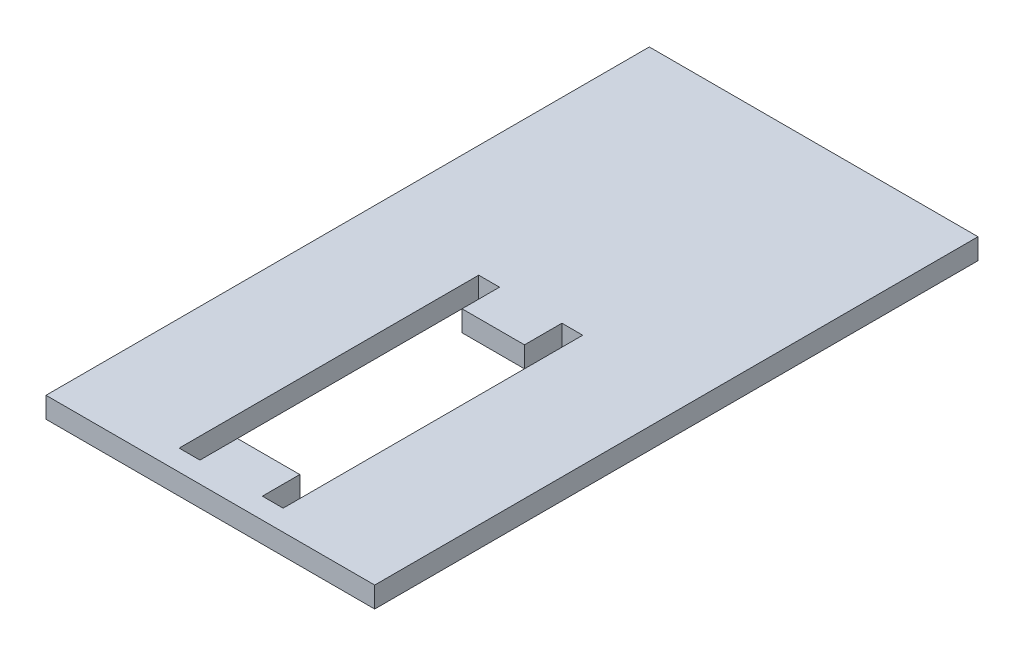
ISO-10303-21;
HEADER;
FILE_DESCRIPTION(('STEP AP214'),'2;1');
FILE_NAME('part.step','',(''),(''),'','','');
FILE_SCHEMA(('AUTOMOTIVE_DESIGN { 1 0 10303 214 1 1 1 1 }'));
ENDSEC;
DATA;
#1=APPLICATION_CONTEXT('core data for automotive mechanical design processes');
#2=APPLICATION_PROTOCOL_DEFINITION('international standard','automotive_design',2000,#1);
#3=PRODUCT_CONTEXT('',#1,'mechanical');
#4=PRODUCT('Part','Part','',(#3));
#5=PRODUCT_RELATED_PRODUCT_CATEGORY('part','',(#4));
#6=PRODUCT_DEFINITION_FORMATION('','',#4);
#7=PRODUCT_DEFINITION_CONTEXT('part definition',#1,'design');
#8=PRODUCT_DEFINITION('design','',#6,#7);
#9=PRODUCT_DEFINITION_SHAPE('','',#8);
#10=(LENGTH_UNIT() NAMED_UNIT(*) SI_UNIT(.MILLI.,.METRE.));
#11=(NAMED_UNIT(*) PLANE_ANGLE_UNIT() SI_UNIT($,.RADIAN.));
#12=(NAMED_UNIT(*) SI_UNIT($,.STERADIAN.) SOLID_ANGLE_UNIT());
#13=UNCERTAINTY_MEASURE_WITH_UNIT(LENGTH_MEASURE(1.E-05),#10,'distance_accuracy_value','');
#14=(GEOMETRIC_REPRESENTATION_CONTEXT(3) GLOBAL_UNCERTAINTY_ASSIGNED_CONTEXT((#13)) GLOBAL_UNIT_ASSIGNED_CONTEXT((#10,
#11,#12)) REPRESENTATION_CONTEXT('',''));
#15=CARTESIAN_POINT('',(0.,0.,0.));
#16=DIRECTION('',(0.,0.,1.));
#17=DIRECTION('',(1.,0.,0.));
#18=AXIS2_PLACEMENT_3D('',#15,#16,#17);
#19=CARTESIAN_POINT('',(-43.762748951782,5.,-45.3958726415094));
#20=DIRECTION('',(1.,0.,0.));
#21=DIRECTION('',(0.,0.,-1.));
#22=AXIS2_PLACEMENT_3D('',#19,#20,#21);
#23=PLANE('',#22);
#24=DIRECTION('',(0.,0.,1.));
#25=VECTOR('',#24,1.);
#26=CARTESIAN_POINT('',(-43.762748951782,0.,-45.3958726415094));
#27=LINE('',#26,#25);
#28=CARTESIAN_POINT('',(-43.762748951782,0.,-45.3958726415094));
#29=VERTEX_POINT('',#28);
#30=CARTESIAN_POINT('',(-43.7627489517819,0.,99.6041273584906));
#31=VERTEX_POINT('',#30);
#32=EDGE_CURVE('E157',#29,#31,#27,.T.);
#33=ORIENTED_EDGE('',*,*,#32,.T.);
#34=DIRECTION('',(0.,-1.,0.));
#35=VECTOR('',#34,1.);
#36=CARTESIAN_POINT('',(-43.7627489517819,5.,99.6041273584906));
#37=LINE('',#36,#35);
#38=CARTESIAN_POINT('',(-43.7627489517819,5.,99.6041273584906));
#39=VERTEX_POINT('',#38);
#40=EDGE_CURVE('E11',#39,#31,#37,.T.);
#41=ORIENTED_EDGE('',*,*,#40,.F.);
#42=DIRECTION('',(0.,0.,1.));
#43=VECTOR('',#42,1.);
#44=CARTESIAN_POINT('',(-43.762748951782,5.,-45.3958726415094));
#45=LINE('',#44,#43);
#46=CARTESIAN_POINT('',(-43.762748951782,5.,-45.3958726415094));
#47=VERTEX_POINT('',#46);
#48=EDGE_CURVE('E222',#47,#39,#45,.T.);
#49=ORIENTED_EDGE('',*,*,#48,.F.);
#50=DIRECTION('',(0.,-1.,0.));
#51=VECTOR('',#50,1.);
#52=CARTESIAN_POINT('',(-43.762748951782,5.,-45.3958726415094));
#53=LINE('',#52,#51);
#54=EDGE_CURVE('E232',#47,#29,#53,.T.);
#55=ORIENTED_EDGE('',*,*,#54,.T.);
#56=EDGE_LOOP('',(#33,#41,#49,#55));
#57=FACE_BOUND('',#56,.T.);
#58=ADVANCED_FACE('F31',(#57),#23,.F.);
#59=CARTESIAN_POINT('',(-43.7627489517819,5.,99.6041273584906));
#60=DIRECTION('',(0.,0.,-1.));
#61=DIRECTION('',(-1.,0.,0.));
#62=AXIS2_PLACEMENT_3D('',#59,#60,#61);
#63=PLANE('',#62);
#64=DIRECTION('',(1.,0.,0.));
#65=VECTOR('',#64,1.);
#66=CARTESIAN_POINT('',(-43.7627489517819,0.,99.6041273584906));
#67=LINE('',#66,#65);
#68=CARTESIAN_POINT('',(35.2372510482181,0.,99.6041273584906));
#69=VERTEX_POINT('',#68);
#70=EDGE_CURVE('E235',#31,#69,#67,.T.);
#71=ORIENTED_EDGE('',*,*,#70,.T.);
#72=DIRECTION('',(0.,-1.,0.));
#73=VECTOR('',#72,1.);
#74=CARTESIAN_POINT('',(35.2372510482181,5.,99.6041273584906));
#75=LINE('',#74,#73);
#76=CARTESIAN_POINT('',(35.2372510482181,5.,99.6041273584906));
#77=VERTEX_POINT('',#76);
#78=EDGE_CURVE('E38',#77,#69,#75,.T.);
#79=ORIENTED_EDGE('',*,*,#78,.F.);
#80=DIRECTION('',(1.,0.,0.));
#81=VECTOR('',#80,1.);
#82=CARTESIAN_POINT('',(-43.7627489517819,5.,99.6041273584906));
#83=LINE('',#82,#81);
#84=EDGE_CURVE('E225',#39,#77,#83,.T.);
#85=ORIENTED_EDGE('',*,*,#84,.F.);
#86=ORIENTED_EDGE('',*,*,#40,.T.);
#87=EDGE_LOOP('',(#71,#79,#85,#86));
#88=FACE_BOUND('',#87,.T.);
#89=ADVANCED_FACE('F263',(#88),#63,.F.);
#90=CARTESIAN_POINT('',(35.237251048218,5.,-45.3958726415094));
#91=DIRECTION('',(-1.,0.,0.));
#92=DIRECTION('',(0.,0.,1.));
#93=AXIS2_PLACEMENT_3D('',#90,#91,#92);
#94=PLANE('',#93);
#95=DIRECTION('',(0.,0.,-1.));
#96=VECTOR('',#95,1.);
#97=CARTESIAN_POINT('',(35.237251048218,0.,-45.3958726415094));
#98=LINE('',#97,#96);
#99=CARTESIAN_POINT('',(35.237251048218,0.,-45.3958726415094));
#100=VERTEX_POINT('',#99);
#101=EDGE_CURVE('E237',#69,#100,#98,.T.);
#102=ORIENTED_EDGE('',*,*,#101,.T.);
#103=DIRECTION('',(0.,-1.,0.));
#104=VECTOR('',#103,1.);
#105=CARTESIAN_POINT('',(35.237251048218,5.,-45.3958726415094));
#106=LINE('',#105,#104);
#107=CARTESIAN_POINT('',(35.237251048218,5.,-45.3958726415094));
#108=VERTEX_POINT('',#107);
#109=EDGE_CURVE('E242',#108,#100,#106,.T.);
#110=ORIENTED_EDGE('',*,*,#109,.F.);
#111=DIRECTION('',(0.,0.,-1.));
#112=VECTOR('',#111,1.);
#113=CARTESIAN_POINT('',(35.237251048218,5.,-45.3958726415094));
#114=LINE('',#113,#112);
#115=EDGE_CURVE('E228',#77,#108,#114,.T.);
#116=ORIENTED_EDGE('',*,*,#115,.F.);
#117=ORIENTED_EDGE('',*,*,#78,.T.);
#118=EDGE_LOOP('',(#102,#110,#116,#117));
#119=FACE_BOUND('',#118,.T.);
#120=ADVANCED_FACE('F249',(#119),#94,.F.);
#121=CARTESIAN_POINT('',(-43.762748951782,5.,-45.3958726415094));
#122=DIRECTION('',(0.,0.,1.));
#123=DIRECTION('',(1.,0.,0.));
#124=AXIS2_PLACEMENT_3D('',#121,#122,#123);
#125=PLANE('',#124);
#126=DIRECTION('',(-1.,0.,0.));
#127=VECTOR('',#126,1.);
#128=CARTESIAN_POINT('',(-43.762748951782,0.,-45.3958726415094));
#129=LINE('',#128,#127);
#130=EDGE_CURVE('E226',#100,#29,#129,.T.);
#131=ORIENTED_EDGE('',*,*,#130,.T.);
#132=ORIENTED_EDGE('',*,*,#54,.F.);
#133=DIRECTION('',(-1.,0.,0.));
#134=VECTOR('',#133,1.);
#135=CARTESIAN_POINT('',(-43.762748951782,5.,-45.3958726415094));
#136=LINE('',#135,#134);
#137=EDGE_CURVE('E230',#108,#47,#136,.T.);
#138=ORIENTED_EDGE('',*,*,#137,.F.);
#139=ORIENTED_EDGE('',*,*,#109,.T.);
#140=EDGE_LOOP('',(#131,#132,#138,#139));
#141=FACE_BOUND('',#140,.T.);
#142=ADVANCED_FACE('F256',(#141),#125,.F.);
#143=CARTESIAN_POINT('',(-43.7627489517819,5.,99.6041273584906));
#144=DIRECTION('',(0.,1.,0.));
#145=DIRECTION('',(0.,0.,1.));
#146=AXIS2_PLACEMENT_3D('',#143,#144,#145);
#147=PLANE('',#146);
#148=DIRECTION('',(0.,0.,1.));
#149=VECTOR('',#148,1.);
#150=CARTESIAN_POINT('',(-16.7627489517819,5.,22.6041273584906));
#151=LINE('',#150,#149);
#152=CARTESIAN_POINT('',(-16.7627489517819,5.,22.6041273584906));
#153=VERTEX_POINT('',#152);
#154=CARTESIAN_POINT('',(-16.7627489517819,5.,94.6041273584906));
#155=VERTEX_POINT('',#154);
#156=EDGE_CURVE('E45',#153,#155,#151,.T.);
#157=ORIENTED_EDGE('',*,*,#156,.F.);
#158=DIRECTION('',(-1.,0.,0.));
#159=VECTOR('',#158,1.);
#160=CARTESIAN_POINT('',(-16.7627489517819,5.,22.6041273584906));
#161=LINE('',#160,#159);
#162=CARTESIAN_POINT('',(-11.7627489517819,5.,22.6041273584906));
#163=VERTEX_POINT('',#162);
#164=EDGE_CURVE('E151',#163,#153,#161,.T.);
#165=ORIENTED_EDGE('',*,*,#164,.F.);
#166=DIRECTION('',(0.,0.,-1.));
#167=VECTOR('',#166,1.);
#168=CARTESIAN_POINT('',(-11.7627489517819,5.,22.6041273584906));
#169=LINE('',#168,#167);
#170=CARTESIAN_POINT('',(-11.7627489517819,5.,31.6041273584906));
#171=VERTEX_POINT('',#170);
#172=EDGE_CURVE('E197',#171,#163,#169,.T.);
#173=ORIENTED_EDGE('',*,*,#172,.F.);
#174=DIRECTION('',(-1.,0.,0.));
#175=VECTOR('',#174,1.);
#176=CARTESIAN_POINT('',(-11.7627489517819,5.,31.6041273584906));
#177=LINE('',#176,#175);
#178=CARTESIAN_POINT('',(3.23725104821805,5.,31.6041273584906));
#179=VERTEX_POINT('',#178);
#180=EDGE_CURVE('E194',#179,#171,#177,.T.);
#181=ORIENTED_EDGE('',*,*,#180,.F.);
#182=DIRECTION('',(0.,0.,1.));
#183=VECTOR('',#182,1.);
#184=CARTESIAN_POINT('',(3.23725104821805,5.,31.6041273584906));
#185=LINE('',#184,#183);
#186=CARTESIAN_POINT('',(3.23725104821805,5.,22.6041273584906));
#187=VERTEX_POINT('',#186);
#188=EDGE_CURVE('E191',#187,#179,#185,.T.);
#189=ORIENTED_EDGE('',*,*,#188,.F.);
#190=DIRECTION('',(-1.,0.,0.));
#191=VECTOR('',#190,1.);
#192=CARTESIAN_POINT('',(3.23725104821805,5.,22.6041273584906));
#193=LINE('',#192,#191);
#194=CARTESIAN_POINT('',(8.23725104821805,5.,22.6041273584906));
#195=VERTEX_POINT('',#194);
#196=EDGE_CURVE('E188',#195,#187,#193,.T.);
#197=ORIENTED_EDGE('',*,*,#196,.F.);
#198=DIRECTION('',(0.,0.,-1.));
#199=VECTOR('',#198,1.);
#200=CARTESIAN_POINT('',(8.23725104821805,5.,22.6041273584906));
#201=LINE('',#200,#199);
#202=CARTESIAN_POINT('',(8.23725104821806,5.,94.6041273584906));
#203=VERTEX_POINT('',#202);
#204=EDGE_CURVE('E185',#203,#195,#201,.T.);
#205=ORIENTED_EDGE('',*,*,#204,.F.);
#206=DIRECTION('',(1.,0.,0.));
#207=VECTOR('',#206,1.);
#208=CARTESIAN_POINT('',(3.23725104821805,5.,94.6041273584906));
#209=LINE('',#208,#207);
#210=CARTESIAN_POINT('',(3.23725104821805,5.,94.6041273584906));
#211=VERTEX_POINT('',#210);
#212=EDGE_CURVE('E182',#211,#203,#209,.T.);
#213=ORIENTED_EDGE('',*,*,#212,.F.);
#214=DIRECTION('',(0.,0.,1.));
#215=VECTOR('',#214,1.);
#216=CARTESIAN_POINT('',(3.23725104821805,5.,94.6041273584906));
#217=LINE('',#216,#215);
#218=CARTESIAN_POINT('',(3.23725104821805,5.,85.6041273584906));
#219=VERTEX_POINT('',#218);
#220=EDGE_CURVE('E179',#219,#211,#217,.T.);
#221=ORIENTED_EDGE('',*,*,#220,.F.);
#222=DIRECTION('',(1.,0.,0.));
#223=VECTOR('',#222,1.);
#224=CARTESIAN_POINT('',(3.23725104821805,5.,85.6041273584906));
#225=LINE('',#224,#223);
#226=CARTESIAN_POINT('',(-11.7627489517819,5.,85.6041273584906));
#227=VERTEX_POINT('',#226);
#228=EDGE_CURVE('E176',#227,#219,#225,.T.);
#229=ORIENTED_EDGE('',*,*,#228,.F.);
#230=DIRECTION('',(0.,0.,-1.));
#231=VECTOR('',#230,1.);
#232=CARTESIAN_POINT('',(-11.7627489517819,5.,85.6041273584906));
#233=LINE('',#232,#231);
#234=CARTESIAN_POINT('',(-11.7627489517819,5.,94.6041273584906));
#235=VERTEX_POINT('',#234);
#236=EDGE_CURVE('E173',#235,#227,#233,.T.);
#237=ORIENTED_EDGE('',*,*,#236,.F.);
#238=DIRECTION('',(1.,0.,0.));
#239=VECTOR('',#238,1.);
#240=CARTESIAN_POINT('',(-16.7627489517819,5.,94.6041273584906));
#241=LINE('',#240,#239);
#242=EDGE_CURVE('E166',#155,#235,#241,.T.);
#243=ORIENTED_EDGE('',*,*,#242,.F.);
#244=EDGE_LOOP('',(#157,#165,#173,#181,#189,#197,#205,#213,#221,#229,#237,#243));
#245=FACE_BOUND('',#244,.T.);
#246=ORIENTED_EDGE('',*,*,#48,.T.);
#247=ORIENTED_EDGE('',*,*,#84,.T.);
#248=ORIENTED_EDGE('',*,*,#115,.T.);
#249=ORIENTED_EDGE('',*,*,#137,.T.);
#250=EDGE_LOOP('',(#246,#247,#248,#249));
#251=FACE_BOUND('',#250,.T.);
#252=ADVANCED_FACE('F262',(#245,#251),#147,.T.);
#253=CARTESIAN_POINT('',(-43.7627489517819,0.,99.6041273584906));
#254=DIRECTION('',(0.,1.,0.));
#255=DIRECTION('',(0.,0.,1.));
#256=AXIS2_PLACEMENT_3D('',#253,#254,#255);
#257=PLANE('',#256);
#258=DIRECTION('',(1.,0.,0.));
#259=VECTOR('',#258,1.);
#260=CARTESIAN_POINT('',(-16.7627489517819,0.,22.6041273584906));
#261=LINE('',#260,#259);
#262=CARTESIAN_POINT('',(-16.7627489517819,0.,22.6041273584906));
#263=VERTEX_POINT('',#262);
#264=CARTESIAN_POINT('',(-11.7627489517819,0.,22.6041273584906));
#265=VERTEX_POINT('',#264);
#266=EDGE_CURVE('E164',#263,#265,#261,.T.);
#267=ORIENTED_EDGE('',*,*,#266,.F.);
#268=DIRECTION('',(0.,0.,-1.));
#269=VECTOR('',#268,1.);
#270=CARTESIAN_POINT('',(-16.7627489517819,0.,22.6041273584906));
#271=LINE('',#270,#269);
#272=CARTESIAN_POINT('',(-16.7627489517819,0.,94.6041273584906));
#273=VERTEX_POINT('',#272);
#274=EDGE_CURVE('E145',#273,#263,#271,.T.);
#275=ORIENTED_EDGE('',*,*,#274,.F.);
#276=DIRECTION('',(-1.,0.,0.));
#277=VECTOR('',#276,1.);
#278=CARTESIAN_POINT('',(-16.7627489517819,0.,94.6041273584906));
#279=LINE('',#278,#277);
#280=CARTESIAN_POINT('',(-11.7627489517819,0.,94.6041273584906));
#281=VERTEX_POINT('',#280);
#282=EDGE_CURVE('E154',#281,#273,#279,.T.);
#283=ORIENTED_EDGE('',*,*,#282,.F.);
#284=DIRECTION('',(0.,0.,1.));
#285=VECTOR('',#284,1.);
#286=CARTESIAN_POINT('',(-11.7627489517819,0.,85.6041273584906));
#287=LINE('',#286,#285);
#288=CARTESIAN_POINT('',(-11.7627489517819,0.,85.6041273584906));
#289=VERTEX_POINT('',#288);
#290=EDGE_CURVE('E53',#289,#281,#287,.T.);
#291=ORIENTED_EDGE('',*,*,#290,.F.);
#292=DIRECTION('',(-1.,0.,0.));
#293=VECTOR('',#292,1.);
#294=CARTESIAN_POINT('',(3.23725104821805,0.,85.6041273584906));
#295=LINE('',#294,#293);
#296=CARTESIAN_POINT('',(3.23725104821805,0.,85.6041273584906));
#297=VERTEX_POINT('',#296);
#298=EDGE_CURVE('E344',#297,#289,#295,.T.);
#299=ORIENTED_EDGE('',*,*,#298,.F.);
#300=DIRECTION('',(0.,0.,-1.));
#301=VECTOR('',#300,1.);
#302=CARTESIAN_POINT('',(3.23725104821805,0.,94.6041273584906));
#303=LINE('',#302,#301);
#304=CARTESIAN_POINT('',(3.23725104821805,0.,94.6041273584906));
#305=VERTEX_POINT('',#304);
#306=EDGE_CURVE('E341',#305,#297,#303,.T.);
#307=ORIENTED_EDGE('',*,*,#306,.F.);
#308=DIRECTION('',(-1.,0.,0.));
#309=VECTOR('',#308,1.);
#310=CARTESIAN_POINT('',(3.23725104821805,0.,94.6041273584906));
#311=LINE('',#310,#309);
#312=CARTESIAN_POINT('',(8.23725104821806,0.,94.6041273584906));
#313=VERTEX_POINT('',#312);
#314=EDGE_CURVE('E338',#313,#305,#311,.T.);
#315=ORIENTED_EDGE('',*,*,#314,.F.);
#316=DIRECTION('',(0.,0.,1.));
#317=VECTOR('',#316,1.);
#318=CARTESIAN_POINT('',(8.23725104821805,0.,22.6041273584906));
#319=LINE('',#318,#317);
#320=CARTESIAN_POINT('',(8.23725104821805,0.,22.6041273584906));
#321=VERTEX_POINT('',#320);
#322=EDGE_CURVE('E335',#321,#313,#319,.T.);
#323=ORIENTED_EDGE('',*,*,#322,.F.);
#324=DIRECTION('',(1.,0.,0.));
#325=VECTOR('',#324,1.);
#326=CARTESIAN_POINT('',(3.23725104821805,0.,22.6041273584906));
#327=LINE('',#326,#325);
#328=CARTESIAN_POINT('',(3.23725104821805,0.,22.6041273584906));
#329=VERTEX_POINT('',#328);
#330=EDGE_CURVE('E332',#329,#321,#327,.T.);
#331=ORIENTED_EDGE('',*,*,#330,.F.);
#332=DIRECTION('',(0.,0.,-1.));
#333=VECTOR('',#332,1.);
#334=CARTESIAN_POINT('',(3.23725104821805,0.,31.6041273584906));
#335=LINE('',#334,#333);
#336=CARTESIAN_POINT('',(3.23725104821805,0.,31.6041273584906));
#337=VERTEX_POINT('',#336);
#338=EDGE_CURVE('E327',#337,#329,#335,.T.);
#339=ORIENTED_EDGE('',*,*,#338,.F.);
#340=DIRECTION('',(1.,0.,0.));
#341=VECTOR('',#340,1.);
#342=CARTESIAN_POINT('',(-11.7627489517819,0.,31.6041273584906));
#343=LINE('',#342,#341);
#344=CARTESIAN_POINT('',(-11.7627489517819,0.,31.6041273584906));
#345=VERTEX_POINT('',#344);
#346=EDGE_CURVE('E326',#345,#337,#343,.T.);
#347=ORIENTED_EDGE('',*,*,#346,.F.);
#348=DIRECTION('',(0.,0.,1.));
#349=VECTOR('',#348,1.);
#350=CARTESIAN_POINT('',(-11.7627489517819,0.,22.6041273584906));
#351=LINE('',#350,#349);
#352=EDGE_CURVE('E168',#265,#345,#351,.T.);
#353=ORIENTED_EDGE('',*,*,#352,.F.);
#354=EDGE_LOOP('',(#267,#275,#283,#291,#299,#307,#315,#323,#331,#339,#347,#353));
#355=FACE_BOUND('',#354,.T.);
#356=ORIENTED_EDGE('',*,*,#32,.F.);
#357=ORIENTED_EDGE('',*,*,#130,.F.);
#358=ORIENTED_EDGE('',*,*,#101,.F.);
#359=ORIENTED_EDGE('',*,*,#70,.F.);
#360=EDGE_LOOP('',(#356,#357,#358,#359));
#361=FACE_BOUND('',#360,.T.);
#362=ADVANCED_FACE('F160',(#355,#361),#257,.F.);
#363=CARTESIAN_POINT('',(-16.7627489517819,-0.00100000000000013,22.6041273584906));
#364=DIRECTION('',(-1.,0.,0.));
#365=DIRECTION('',(0.,0.,1.));
#366=AXIS2_PLACEMENT_3D('',#363,#364,#365);
#367=PLANE('',#366);
#368=ORIENTED_EDGE('',*,*,#274,.T.);
#369=DIRECTION('',(0.,1.,0.));
#370=VECTOR('',#369,1.);
#371=CARTESIAN_POINT('',(-16.7627489517819,-0.00100000000000013,22.6041273584906));
#372=LINE('',#371,#370);
#373=EDGE_CURVE('E158',#263,#153,#372,.T.);
#374=ORIENTED_EDGE('',*,*,#373,.T.);
#375=ORIENTED_EDGE('',*,*,#156,.T.);
#376=DIRECTION('',(0.,1.,0.));
#377=VECTOR('',#376,1.);
#378=CARTESIAN_POINT('',(-16.7627489517819,-0.00100000000000013,94.6041273584906));
#379=LINE('',#378,#377);
#380=EDGE_CURVE('E141',#273,#155,#379,.T.);
#381=ORIENTED_EDGE('',*,*,#380,.F.);
#382=EDGE_LOOP('',(#368,#374,#375,#381));
#383=FACE_BOUND('',#382,.T.);
#384=ADVANCED_FACE('F143',(#383),#367,.F.);
#385=CARTESIAN_POINT('',(-16.7627489517819,-0.00100000000000013,22.6041273584906));
#386=DIRECTION('',(0.,0.,-1.));
#387=DIRECTION('',(-1.,0.,0.));
#388=AXIS2_PLACEMENT_3D('',#385,#386,#387);
#389=PLANE('',#388);
#390=ORIENTED_EDGE('',*,*,#266,.T.);
#391=DIRECTION('',(0.,1.,0.));
#392=VECTOR('',#391,1.);
#393=CARTESIAN_POINT('',(-11.7627489517819,-0.00100000000000013,22.6041273584906));
#394=LINE('',#393,#392);
#395=EDGE_CURVE('E203',#265,#163,#394,.T.);
#396=ORIENTED_EDGE('',*,*,#395,.T.);
#397=ORIENTED_EDGE('',*,*,#164,.T.);
#398=ORIENTED_EDGE('',*,*,#373,.F.);
#399=EDGE_LOOP('',(#390,#396,#397,#398));
#400=FACE_BOUND('',#399,.T.);
#401=ADVANCED_FACE('F280',(#400),#389,.F.);
#402=CARTESIAN_POINT('',(-11.7627489517819,-0.00100000000000013,22.6041273584906));
#403=DIRECTION('',(1.,0.,0.));
#404=DIRECTION('',(0.,0.,-1.));
#405=AXIS2_PLACEMENT_3D('',#402,#403,#404);
#406=PLANE('',#405);
#407=ORIENTED_EDGE('',*,*,#352,.T.);
#408=DIRECTION('',(0.,1.,0.));
#409=VECTOR('',#408,1.);
#410=CARTESIAN_POINT('',(-11.7627489517819,-0.00100000000000013,31.6041273584906));
#411=LINE('',#410,#409);
#412=EDGE_CURVE('E205',#345,#171,#411,.T.);
#413=ORIENTED_EDGE('',*,*,#412,.T.);
#414=ORIENTED_EDGE('',*,*,#172,.T.);
#415=ORIENTED_EDGE('',*,*,#395,.F.);
#416=EDGE_LOOP('',(#407,#413,#414,#415));
#417=FACE_BOUND('',#416,.T.);
#418=ADVANCED_FACE('F313',(#417),#406,.F.);
#419=CARTESIAN_POINT('',(-11.7627489517819,-0.00100000000000013,31.6041273584906));
#420=DIRECTION('',(0.,0.,-1.));
#421=DIRECTION('',(-1.,0.,0.));
#422=AXIS2_PLACEMENT_3D('',#419,#420,#421);
#423=PLANE('',#422);
#424=ORIENTED_EDGE('',*,*,#346,.T.);
#425=DIRECTION('',(0.,1.,0.));
#426=VECTOR('',#425,1.);
#427=CARTESIAN_POINT('',(3.23725104821805,-0.00100000000000013,31.6041273584906));
#428=LINE('',#427,#426);
#429=EDGE_CURVE('E207',#337,#179,#428,.T.);
#430=ORIENTED_EDGE('',*,*,#429,.T.);
#431=ORIENTED_EDGE('',*,*,#180,.T.);
#432=ORIENTED_EDGE('',*,*,#412,.F.);
#433=EDGE_LOOP('',(#424,#430,#431,#432));
#434=FACE_BOUND('',#433,.T.);
#435=ADVANCED_FACE('F309',(#434),#423,.F.);
#436=CARTESIAN_POINT('',(3.23725104821805,-0.00100000000000013,31.6041273584906));
#437=DIRECTION('',(-1.,0.,0.));
#438=DIRECTION('',(0.,0.,1.));
#439=AXIS2_PLACEMENT_3D('',#436,#437,#438);
#440=PLANE('',#439);
#441=ORIENTED_EDGE('',*,*,#338,.T.);
#442=DIRECTION('',(0.,1.,0.));
#443=VECTOR('',#442,1.);
#444=CARTESIAN_POINT('',(3.23725104821805,-0.00100000000000013,22.6041273584906));
#445=LINE('',#444,#443);
#446=EDGE_CURVE('E209',#329,#187,#445,.T.);
#447=ORIENTED_EDGE('',*,*,#446,.T.);
#448=ORIENTED_EDGE('',*,*,#188,.T.);
#449=ORIENTED_EDGE('',*,*,#429,.F.);
#450=EDGE_LOOP('',(#441,#447,#448,#449));
#451=FACE_BOUND('',#450,.T.);
#452=ADVANCED_FACE('F305',(#451),#440,.F.);
#453=CARTESIAN_POINT('',(3.23725104821805,-0.00100000000000013,22.6041273584906));
#454=DIRECTION('',(0.,0.,-1.));
#455=DIRECTION('',(-1.,0.,0.));
#456=AXIS2_PLACEMENT_3D('',#453,#454,#455);
#457=PLANE('',#456);
#458=ORIENTED_EDGE('',*,*,#330,.T.);
#459=DIRECTION('',(0.,1.,0.));
#460=VECTOR('',#459,1.);
#461=CARTESIAN_POINT('',(8.23725104821805,-0.00100000000000013,22.6041273584906));
#462=LINE('',#461,#460);
#463=EDGE_CURVE('E211',#321,#195,#462,.T.);
#464=ORIENTED_EDGE('',*,*,#463,.T.);
#465=ORIENTED_EDGE('',*,*,#196,.T.);
#466=ORIENTED_EDGE('',*,*,#446,.F.);
#467=EDGE_LOOP('',(#458,#464,#465,#466));
#468=FACE_BOUND('',#467,.T.);
#469=ADVANCED_FACE('F301',(#468),#457,.F.);
#470=CARTESIAN_POINT('',(8.23725104821805,-0.00100000000000013,22.6041273584906));
#471=DIRECTION('',(1.,0.,0.));
#472=DIRECTION('',(0.,0.,-1.));
#473=AXIS2_PLACEMENT_3D('',#470,#471,#472);
#474=PLANE('',#473);
#475=ORIENTED_EDGE('',*,*,#322,.T.);
#476=DIRECTION('',(0.,1.,0.));
#477=VECTOR('',#476,1.);
#478=CARTESIAN_POINT('',(8.23725104821806,-0.00100000000000013,94.6041273584906));
#479=LINE('',#478,#477);
#480=EDGE_CURVE('E213',#313,#203,#479,.T.);
#481=ORIENTED_EDGE('',*,*,#480,.T.);
#482=ORIENTED_EDGE('',*,*,#204,.T.);
#483=ORIENTED_EDGE('',*,*,#463,.F.);
#484=EDGE_LOOP('',(#475,#481,#482,#483));
#485=FACE_BOUND('',#484,.T.);
#486=ADVANCED_FACE('F297',(#485),#474,.F.);
#487=CARTESIAN_POINT('',(3.23725104821805,-0.00100000000000013,94.6041273584906));
#488=DIRECTION('',(0.,0.,1.));
#489=DIRECTION('',(1.,0.,0.));
#490=AXIS2_PLACEMENT_3D('',#487,#488,#489);
#491=PLANE('',#490);
#492=ORIENTED_EDGE('',*,*,#314,.T.);
#493=DIRECTION('',(0.,1.,0.));
#494=VECTOR('',#493,1.);
#495=CARTESIAN_POINT('',(3.23725104821805,-0.00100000000000013,94.6041273584906));
#496=LINE('',#495,#494);
#497=EDGE_CURVE('E215',#305,#211,#496,.T.);
#498=ORIENTED_EDGE('',*,*,#497,.T.);
#499=ORIENTED_EDGE('',*,*,#212,.T.);
#500=ORIENTED_EDGE('',*,*,#480,.F.);
#501=EDGE_LOOP('',(#492,#498,#499,#500));
#502=FACE_BOUND('',#501,.T.);
#503=ADVANCED_FACE('F293',(#502),#491,.F.);
#504=CARTESIAN_POINT('',(3.23725104821805,-0.00100000000000013,94.6041273584906));
#505=DIRECTION('',(-1.,0.,0.));
#506=DIRECTION('',(0.,0.,1.));
#507=AXIS2_PLACEMENT_3D('',#504,#505,#506);
#508=PLANE('',#507);
#509=ORIENTED_EDGE('',*,*,#306,.T.);
#510=DIRECTION('',(0.,1.,0.));
#511=VECTOR('',#510,1.);
#512=CARTESIAN_POINT('',(3.23725104821805,-0.00100000000000013,85.6041273584906));
#513=LINE('',#512,#511);
#514=EDGE_CURVE('E217',#297,#219,#513,.T.);
#515=ORIENTED_EDGE('',*,*,#514,.T.);
#516=ORIENTED_EDGE('',*,*,#220,.T.);
#517=ORIENTED_EDGE('',*,*,#497,.F.);
#518=EDGE_LOOP('',(#509,#515,#516,#517));
#519=FACE_BOUND('',#518,.T.);
#520=ADVANCED_FACE('F289',(#519),#508,.F.);
#521=CARTESIAN_POINT('',(3.23725104821805,-0.00100000000000013,85.6041273584906));
#522=DIRECTION('',(0.,0.,1.));
#523=DIRECTION('',(1.,0.,0.));
#524=AXIS2_PLACEMENT_3D('',#521,#522,#523);
#525=PLANE('',#524);
#526=ORIENTED_EDGE('',*,*,#298,.T.);
#527=DIRECTION('',(0.,1.,0.));
#528=VECTOR('',#527,1.);
#529=CARTESIAN_POINT('',(-11.7627489517819,-0.00100000000000013,85.6041273584906));
#530=LINE('',#529,#528);
#531=EDGE_CURVE('E219',#289,#227,#530,.T.);
#532=ORIENTED_EDGE('',*,*,#531,.T.);
#533=ORIENTED_EDGE('',*,*,#228,.T.);
#534=ORIENTED_EDGE('',*,*,#514,.F.);
#535=EDGE_LOOP('',(#526,#532,#533,#534));
#536=FACE_BOUND('',#535,.T.);
#537=ADVANCED_FACE('F286',(#536),#525,.F.);
#538=CARTESIAN_POINT('',(-11.7627489517819,-0.00100000000000013,85.6041273584906));
#539=DIRECTION('',(1.,0.,0.));
#540=DIRECTION('',(0.,0.,-1.));
#541=AXIS2_PLACEMENT_3D('',#538,#539,#540);
#542=PLANE('',#541);
#543=ORIENTED_EDGE('',*,*,#290,.T.);
#544=DIRECTION('',(0.,1.,0.));
#545=VECTOR('',#544,1.);
#546=CARTESIAN_POINT('',(-11.7627489517819,-0.00100000000000013,94.6041273584906));
#547=LINE('',#546,#545);
#548=EDGE_CURVE('E150',#281,#235,#547,.T.);
#549=ORIENTED_EDGE('',*,*,#548,.T.);
#550=ORIENTED_EDGE('',*,*,#236,.T.);
#551=ORIENTED_EDGE('',*,*,#531,.F.);
#552=EDGE_LOOP('',(#543,#549,#550,#551));
#553=FACE_BOUND('',#552,.T.);
#554=ADVANCED_FACE('F283',(#553),#542,.F.);
#555=CARTESIAN_POINT('',(-16.7627489517819,-0.00100000000000013,94.6041273584906));
#556=DIRECTION('',(0.,0.,1.));
#557=DIRECTION('',(1.,0.,0.));
#558=AXIS2_PLACEMENT_3D('',#555,#556,#557);
#559=PLANE('',#558);
#560=ORIENTED_EDGE('',*,*,#282,.T.);
#561=ORIENTED_EDGE('',*,*,#380,.T.);
#562=ORIENTED_EDGE('',*,*,#242,.T.);
#563=ORIENTED_EDGE('',*,*,#548,.F.);
#564=EDGE_LOOP('',(#560,#561,#562,#563));
#565=FACE_BOUND('',#564,.T.);
#566=ADVANCED_FACE('F155',(#565),#559,.F.);
#567=CLOSED_SHELL('',(#58,#89,#120,#142,#252,#362,#384,#401,#418,#435,#452,#469,#486,#503,#520,
#537,#554,#566));
#568=MANIFOLD_SOLID_BREP('B2',#567);
#569=ADVANCED_BREP_SHAPE_REPRESENTATION('',(#18,#568),#14);
#570=SHAPE_DEFINITION_REPRESENTATION(#9,#569);
ENDSEC;
END-ISO-10303-21;
